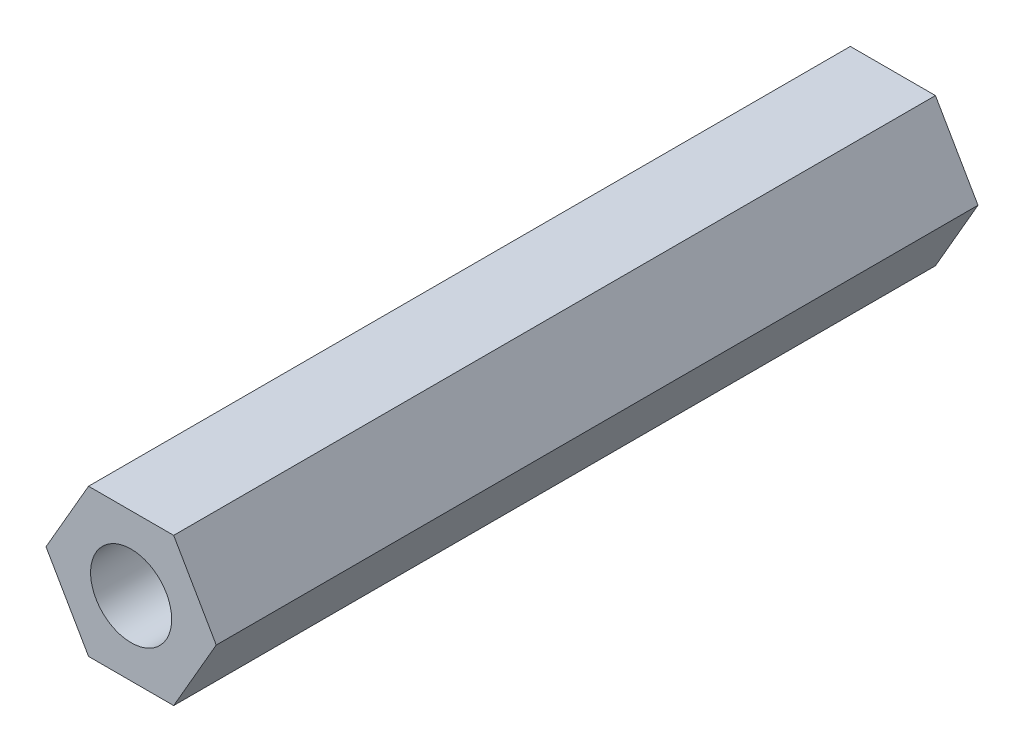
ISO-10303-21;
HEADER;
FILE_DESCRIPTION(('STEP AP214'),'2;1');
FILE_NAME('part.step','',(''),(''),'','','');
FILE_SCHEMA(('AUTOMOTIVE_DESIGN { 1 0 10303 214 1 1 1 1 }'));
ENDSEC;
DATA;
#1=APPLICATION_CONTEXT('core data for automotive mechanical design processes');
#2=APPLICATION_PROTOCOL_DEFINITION('international standard','automotive_design',2000,#1);
#3=PRODUCT_CONTEXT('',#1,'mechanical');
#4=PRODUCT('Part','Part','',(#3));
#5=PRODUCT_RELATED_PRODUCT_CATEGORY('part','',(#4));
#6=PRODUCT_DEFINITION_FORMATION('','',#4);
#7=PRODUCT_DEFINITION_CONTEXT('part definition',#1,'design');
#8=PRODUCT_DEFINITION('design','',#6,#7);
#9=PRODUCT_DEFINITION_SHAPE('','',#8);
#10=(LENGTH_UNIT() NAMED_UNIT(*) SI_UNIT(.MILLI.,.METRE.));
#11=(NAMED_UNIT(*) PLANE_ANGLE_UNIT() SI_UNIT($,.RADIAN.));
#12=(NAMED_UNIT(*) SI_UNIT($,.STERADIAN.) SOLID_ANGLE_UNIT());
#13=UNCERTAINTY_MEASURE_WITH_UNIT(LENGTH_MEASURE(1.E-05),#10,'distance_accuracy_value','');
#14=(GEOMETRIC_REPRESENTATION_CONTEXT(3) GLOBAL_UNCERTAINTY_ASSIGNED_CONTEXT((#13)) GLOBAL_UNIT_ASSIGNED_CONTEXT((#10,
#11,#12)) REPRESENTATION_CONTEXT('',''));
#15=CARTESIAN_POINT('',(0.,0.,0.));
#16=DIRECTION('',(0.,0.,1.));
#17=DIRECTION('',(1.,0.,0.));
#18=AXIS2_PLACEMENT_3D('',#15,#16,#17);
#19=CARTESIAN_POINT('',(0.,0.,31.));
#20=DIRECTION('',(0.,0.,1.));
#21=DIRECTION('',(1.,0.,0.));
#22=AXIS2_PLACEMENT_3D('',#19,#20,#21);
#23=PLANE('',#22);
#24=DIRECTION('',(-0.5,0.866025403784439,0.));
#25=VECTOR('',#24,1.);
#26=CARTESIAN_POINT('',(3.46410161513775,0.,31.));
#27=LINE('',#26,#25);
#28=CARTESIAN_POINT('',(3.46410161513775,0.,31.));
#29=VERTEX_POINT('',#28);
#30=CARTESIAN_POINT('',(1.73205080756888,3.,31.));
#31=VERTEX_POINT('',#30);
#32=EDGE_CURVE('E146',#29,#31,#27,.T.);
#33=ORIENTED_EDGE('',*,*,#32,.T.);
#34=DIRECTION('',(-1.,0.,0.));
#35=VECTOR('',#34,1.);
#36=CARTESIAN_POINT('',(1.73205080756888,3.,31.));
#37=LINE('',#36,#35);
#38=CARTESIAN_POINT('',(-1.73205080756888,3.,31.));
#39=VERTEX_POINT('',#38);
#40=EDGE_CURVE('E94',#31,#39,#37,.T.);
#41=ORIENTED_EDGE('',*,*,#40,.T.);
#42=DIRECTION('',(-0.5,-0.866025403784439,0.));
#43=VECTOR('',#42,1.);
#44=CARTESIAN_POINT('',(-1.73205080756888,3.,31.));
#45=LINE('',#44,#43);
#46=CARTESIAN_POINT('',(-3.46410161513775,0.,31.));
#47=VERTEX_POINT('',#46);
#48=EDGE_CURVE('E107',#39,#47,#45,.T.);
#49=ORIENTED_EDGE('',*,*,#48,.T.);
#50=DIRECTION('',(0.5,-0.866025403784439,0.));
#51=VECTOR('',#50,1.);
#52=CARTESIAN_POINT('',(-3.46410161513775,0.,31.));
#53=LINE('',#52,#51);
#54=CARTESIAN_POINT('',(-1.73205080756887,-3.,31.));
#55=VERTEX_POINT('',#54);
#56=EDGE_CURVE('E101',#47,#55,#53,.T.);
#57=ORIENTED_EDGE('',*,*,#56,.T.);
#58=DIRECTION('',(1.,0.,0.));
#59=VECTOR('',#58,1.);
#60=CARTESIAN_POINT('',(-1.73205080756887,-3.,31.));
#61=LINE('',#60,#59);
#62=CARTESIAN_POINT('',(1.73205080756888,-3.,31.));
#63=VERTEX_POINT('',#62);
#64=EDGE_CURVE('E105',#55,#63,#61,.T.);
#65=ORIENTED_EDGE('',*,*,#64,.T.);
#66=DIRECTION('',(0.5,0.866025403784439,0.));
#67=VECTOR('',#66,1.);
#68=CARTESIAN_POINT('',(1.73205080756888,-3.,31.));
#69=LINE('',#68,#67);
#70=EDGE_CURVE('E57',#63,#29,#69,.T.);
#71=ORIENTED_EDGE('',*,*,#70,.T.);
#72=EDGE_LOOP('',(#33,#41,#49,#57,#65,#71));
#73=FACE_BOUND('',#72,.T.);
#74=CARTESIAN_POINT('',(0.,0.,31.));
#75=DIRECTION('',(0.,0.,1.));
#76=DIRECTION('',(1.,0.,0.));
#77=AXIS2_PLACEMENT_3D('',#74,#75,#76);
#78=CIRCLE('',#77,1.65);
#79=CARTESIAN_POINT('',(1.65,0.,31.));
#80=VERTEX_POINT('',#79);
#81=EDGE_CURVE('E134',#80,#80,#78,.T.);
#82=ORIENTED_EDGE('',*,*,#81,.F.);
#83=EDGE_LOOP('',(#82));
#84=FACE_BOUND('',#83,.T.);
#85=ADVANCED_FACE('F39',(#73,#84),#23,.T.);
#86=CARTESIAN_POINT('',(0.,0.,0.));
#87=DIRECTION('',(0.,0.,1.));
#88=DIRECTION('',(1.,0.,0.));
#89=AXIS2_PLACEMENT_3D('',#86,#87,#88);
#90=PLANE('',#89);
#91=DIRECTION('',(-0.5,0.866025403784439,0.));
#92=VECTOR('',#91,1.);
#93=CARTESIAN_POINT('',(3.46410161513775,0.,0.));
#94=LINE('',#93,#92);
#95=CARTESIAN_POINT('',(3.46410161513775,0.,0.));
#96=VERTEX_POINT('',#95);
#97=CARTESIAN_POINT('',(1.73205080756888,3.,0.));
#98=VERTEX_POINT('',#97);
#99=EDGE_CURVE('E129',#96,#98,#94,.T.);
#100=ORIENTED_EDGE('',*,*,#99,.F.);
#101=DIRECTION('',(0.5,0.866025403784439,0.));
#102=VECTOR('',#101,1.);
#103=CARTESIAN_POINT('',(1.73205080756888,-3.,0.));
#104=LINE('',#103,#102);
#105=CARTESIAN_POINT('',(1.73205080756888,-3.,0.));
#106=VERTEX_POINT('',#105);
#107=EDGE_CURVE('E86',#106,#96,#104,.T.);
#108=ORIENTED_EDGE('',*,*,#107,.F.);
#109=DIRECTION('',(1.,0.,0.));
#110=VECTOR('',#109,1.);
#111=CARTESIAN_POINT('',(-1.73205080756887,-3.,0.));
#112=LINE('',#111,#110);
#113=CARTESIAN_POINT('',(-1.73205080756887,-3.,0.));
#114=VERTEX_POINT('',#113);
#115=EDGE_CURVE('E80',#114,#106,#112,.T.);
#116=ORIENTED_EDGE('',*,*,#115,.F.);
#117=DIRECTION('',(0.5,-0.866025403784439,0.));
#118=VECTOR('',#117,1.);
#119=CARTESIAN_POINT('',(-3.46410161513775,0.,0.));
#120=LINE('',#119,#118);
#121=CARTESIAN_POINT('',(-3.46410161513775,0.,0.));
#122=VERTEX_POINT('',#121);
#123=EDGE_CURVE('E116',#122,#114,#120,.T.);
#124=ORIENTED_EDGE('',*,*,#123,.F.);
#125=DIRECTION('',(-0.5,-0.866025403784439,0.));
#126=VECTOR('',#125,1.);
#127=CARTESIAN_POINT('',(-1.73205080756888,3.,0.));
#128=LINE('',#127,#126);
#129=CARTESIAN_POINT('',(-1.73205080756888,3.,0.));
#130=VERTEX_POINT('',#129);
#131=EDGE_CURVE('E137',#130,#122,#128,.T.);
#132=ORIENTED_EDGE('',*,*,#131,.F.);
#133=DIRECTION('',(-1.,0.,0.));
#134=VECTOR('',#133,1.);
#135=CARTESIAN_POINT('',(1.73205080756888,3.,0.));
#136=LINE('',#135,#134);
#137=EDGE_CURVE('E133',#98,#130,#136,.T.);
#138=ORIENTED_EDGE('',*,*,#137,.F.);
#139=EDGE_LOOP('',(#100,#108,#116,#124,#132,#138));
#140=FACE_BOUND('',#139,.T.);
#141=CARTESIAN_POINT('',(0.,0.,0.));
#142=DIRECTION('',(0.,0.,1.));
#143=DIRECTION('',(1.,0.,0.));
#144=AXIS2_PLACEMENT_3D('',#141,#142,#143);
#145=CIRCLE('',#144,1.65);
#146=CARTESIAN_POINT('',(1.65,0.,0.));
#147=VERTEX_POINT('',#146);
#148=EDGE_CURVE('E243',#147,#147,#145,.T.);
#149=ORIENTED_EDGE('',*,*,#148,.T.);
#150=EDGE_LOOP('',(#149));
#151=FACE_BOUND('',#150,.T.);
#152=ADVANCED_FACE('F159',(#140,#151),#90,.F.);
#153=CARTESIAN_POINT('',(3.46410161513775,0.,31.));
#154=DIRECTION('',(-0.866025403784439,-0.5,0.));
#155=DIRECTION('',(0.5,-0.866025403784439,0.));
#156=AXIS2_PLACEMENT_3D('',#153,#154,#155);
#157=PLANE('',#156);
#158=ORIENTED_EDGE('',*,*,#99,.T.);
#159=DIRECTION('',(0.,0.,-1.));
#160=VECTOR('',#159,1.);
#161=CARTESIAN_POINT('',(1.73205080756888,3.,31.));
#162=LINE('',#161,#160);
#163=EDGE_CURVE('E11',#31,#98,#162,.T.);
#164=ORIENTED_EDGE('',*,*,#163,.F.);
#165=ORIENTED_EDGE('',*,*,#32,.F.);
#166=DIRECTION('',(0.,0.,-1.));
#167=VECTOR('',#166,1.);
#168=CARTESIAN_POINT('',(3.46410161513775,0.,31.));
#169=LINE('',#168,#167);
#170=EDGE_CURVE('E125',#29,#96,#169,.T.);
#171=ORIENTED_EDGE('',*,*,#170,.T.);
#172=EDGE_LOOP('',(#158,#164,#165,#171));
#173=FACE_BOUND('',#172,.T.);
#174=ADVANCED_FACE('F41',(#173),#157,.F.);
#175=CARTESIAN_POINT('',(1.73205080756888,3.,31.));
#176=DIRECTION('',(0.,-1.,0.));
#177=DIRECTION('',(0.,0.,-1.));
#178=AXIS2_PLACEMENT_3D('',#175,#176,#177);
#179=PLANE('',#178);
#180=ORIENTED_EDGE('',*,*,#137,.T.);
#181=DIRECTION('',(0.,0.,-1.));
#182=VECTOR('',#181,1.);
#183=CARTESIAN_POINT('',(-1.73205080756888,3.,31.));
#184=LINE('',#183,#182);
#185=EDGE_CURVE('E49',#39,#130,#184,.T.);
#186=ORIENTED_EDGE('',*,*,#185,.F.);
#187=ORIENTED_EDGE('',*,*,#40,.F.);
#188=ORIENTED_EDGE('',*,*,#163,.T.);
#189=EDGE_LOOP('',(#180,#186,#187,#188));
#190=FACE_BOUND('',#189,.T.);
#191=ADVANCED_FACE('F184',(#190),#179,.F.);
#192=CARTESIAN_POINT('',(-1.73205080756888,3.,31.));
#193=DIRECTION('',(0.866025403784439,-0.5,0.));
#194=DIRECTION('',(0.5,0.866025403784439,0.));
#195=AXIS2_PLACEMENT_3D('',#192,#193,#194);
#196=PLANE('',#195);
#197=ORIENTED_EDGE('',*,*,#131,.T.);
#198=DIRECTION('',(0.,0.,-1.));
#199=VECTOR('',#198,1.);
#200=CARTESIAN_POINT('',(-3.46410161513775,0.,31.));
#201=LINE('',#200,#199);
#202=EDGE_CURVE('E118',#47,#122,#201,.T.);
#203=ORIENTED_EDGE('',*,*,#202,.F.);
#204=ORIENTED_EDGE('',*,*,#48,.F.);
#205=ORIENTED_EDGE('',*,*,#185,.T.);
#206=EDGE_LOOP('',(#197,#203,#204,#205));
#207=FACE_BOUND('',#206,.T.);
#208=ADVANCED_FACE('F156',(#207),#196,.F.);
#209=CARTESIAN_POINT('',(-3.46410161513775,0.,31.));
#210=DIRECTION('',(0.866025403784439,0.5,0.));
#211=DIRECTION('',(-0.5,0.866025403784439,0.));
#212=AXIS2_PLACEMENT_3D('',#209,#210,#211);
#213=PLANE('',#212);
#214=ORIENTED_EDGE('',*,*,#123,.T.);
#215=DIRECTION('',(0.,0.,-1.));
#216=VECTOR('',#215,1.);
#217=CARTESIAN_POINT('',(-1.73205080756887,-3.,31.));
#218=LINE('',#217,#216);
#219=EDGE_CURVE('E113',#55,#114,#218,.T.);
#220=ORIENTED_EDGE('',*,*,#219,.F.);
#221=ORIENTED_EDGE('',*,*,#56,.F.);
#222=ORIENTED_EDGE('',*,*,#202,.T.);
#223=EDGE_LOOP('',(#214,#220,#221,#222));
#224=FACE_BOUND('',#223,.T.);
#225=ADVANCED_FACE('F114',(#224),#213,.F.);
#226=CARTESIAN_POINT('',(-1.73205080756887,-3.,31.));
#227=DIRECTION('',(0.,1.,0.));
#228=DIRECTION('',(-1.,0.,0.));
#229=AXIS2_PLACEMENT_3D('',#226,#227,#228);
#230=PLANE('',#229);
#231=ORIENTED_EDGE('',*,*,#115,.T.);
#232=DIRECTION('',(0.,0.,-1.));
#233=VECTOR('',#232,1.);
#234=CARTESIAN_POINT('',(1.73205080756888,-3.,31.));
#235=LINE('',#234,#233);
#236=EDGE_CURVE('E119',#63,#106,#235,.T.);
#237=ORIENTED_EDGE('',*,*,#236,.F.);
#238=ORIENTED_EDGE('',*,*,#64,.F.);
#239=ORIENTED_EDGE('',*,*,#219,.T.);
#240=EDGE_LOOP('',(#231,#237,#238,#239));
#241=FACE_BOUND('',#240,.T.);
#242=ADVANCED_FACE('F121',(#241),#230,.F.);
#243=CARTESIAN_POINT('',(1.73205080756888,-3.,31.));
#244=DIRECTION('',(-0.866025403784439,0.5,0.));
#245=DIRECTION('',(-0.5,-0.866025403784439,0.));
#246=AXIS2_PLACEMENT_3D('',#243,#244,#245);
#247=PLANE('',#246);
#248=ORIENTED_EDGE('',*,*,#107,.T.);
#249=ORIENTED_EDGE('',*,*,#170,.F.);
#250=ORIENTED_EDGE('',*,*,#70,.F.);
#251=ORIENTED_EDGE('',*,*,#236,.T.);
#252=EDGE_LOOP('',(#248,#249,#250,#251));
#253=FACE_BOUND('',#252,.T.);
#254=ADVANCED_FACE('F164',(#253),#247,.F.);
#255=CARTESIAN_POINT('',(0.,0.,31.));
#256=DIRECTION('',(0.,0.,-1.));
#257=DIRECTION('',(-1.,0.,0.));
#258=AXIS2_PLACEMENT_3D('',#255,#256,#257);
#259=CYLINDRICAL_SURFACE('',#258,1.65);
#260=ORIENTED_EDGE('',*,*,#81,.T.);
#261=EDGE_LOOP('',(#260));
#262=FACE_BOUND('',#261,.T.);
#263=ORIENTED_EDGE('',*,*,#148,.F.);
#264=EDGE_LOOP('',(#263));
#265=FACE_BOUND('',#264,.T.);
#266=ADVANCED_FACE('F166',(#262,#265),#259,.F.);
#267=CLOSED_SHELL('',(#85,#152,#174,#191,#208,#225,#242,#254,#266));
#268=MANIFOLD_SOLID_BREP('B2',#267);
#269=ADVANCED_BREP_SHAPE_REPRESENTATION('',(#18,#268),#14);
#270=SHAPE_DEFINITION_REPRESENTATION(#9,#269);
ENDSEC;
END-ISO-10303-21;
